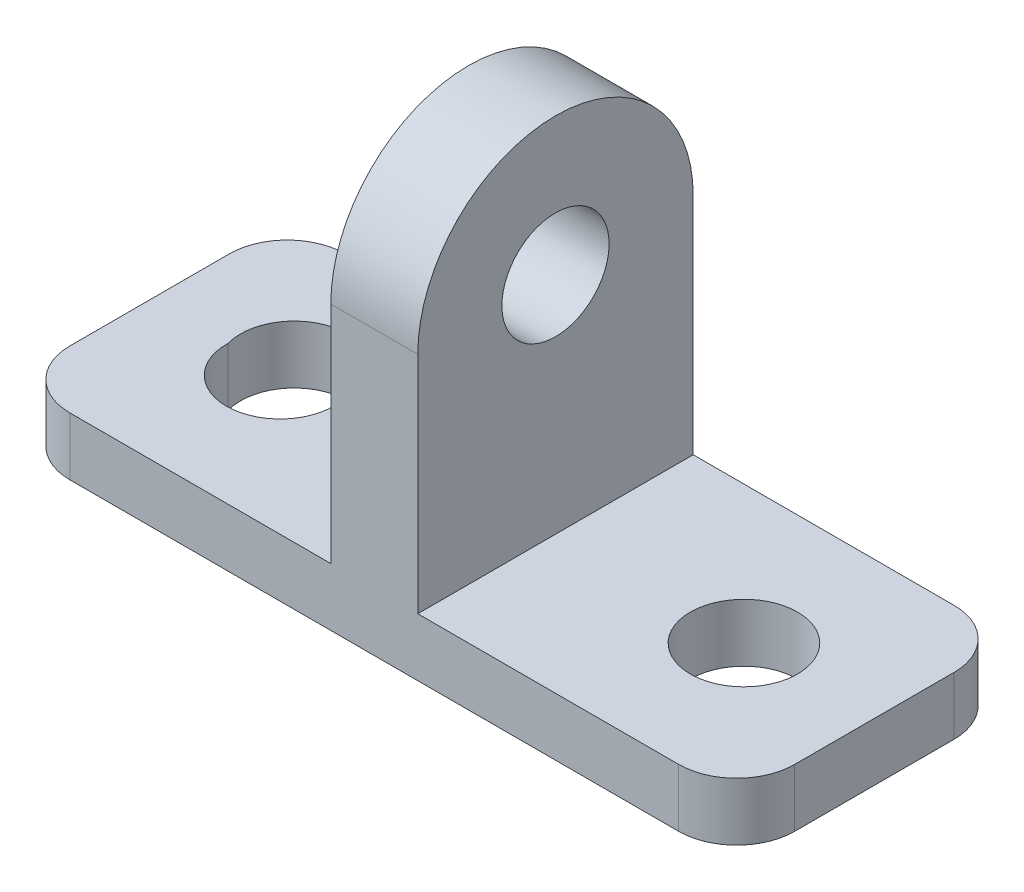
ISO-10303-21;
HEADER;
FILE_DESCRIPTION(('STEP AP214'),'2;1');
FILE_NAME('part.step','',(''),(''),'','','');
FILE_SCHEMA(('AUTOMOTIVE_DESIGN { 1 0 10303 214 1 1 1 1 }'));
ENDSEC;
DATA;
#1=APPLICATION_CONTEXT('core data for automotive mechanical design processes');
#2=APPLICATION_PROTOCOL_DEFINITION('international standard','automotive_design',2000,#1);
#3=PRODUCT_CONTEXT('',#1,'mechanical');
#4=PRODUCT('Part','Part','',(#3));
#5=PRODUCT_RELATED_PRODUCT_CATEGORY('part','',(#4));
#6=PRODUCT_DEFINITION_FORMATION('','',#4);
#7=PRODUCT_DEFINITION_CONTEXT('part definition',#1,'design');
#8=PRODUCT_DEFINITION('design','',#6,#7);
#9=PRODUCT_DEFINITION_SHAPE('','',#8);
#10=(LENGTH_UNIT() NAMED_UNIT(*) SI_UNIT(.MILLI.,.METRE.));
#11=(NAMED_UNIT(*) PLANE_ANGLE_UNIT() SI_UNIT($,.RADIAN.));
#12=(NAMED_UNIT(*) SI_UNIT($,.STERADIAN.) SOLID_ANGLE_UNIT());
#13=UNCERTAINTY_MEASURE_WITH_UNIT(LENGTH_MEASURE(1.E-05),#10,'distance_accuracy_value','');
#14=(GEOMETRIC_REPRESENTATION_CONTEXT(3) GLOBAL_UNCERTAINTY_ASSIGNED_CONTEXT((#13)) GLOBAL_UNIT_ASSIGNED_CONTEXT((#10,
#11,#12)) REPRESENTATION_CONTEXT('',''));
#15=CARTESIAN_POINT('',(0.,0.,0.));
#16=DIRECTION('',(0.,0.,1.));
#17=DIRECTION('',(1.,0.,0.));
#18=AXIS2_PLACEMENT_3D('',#15,#16,#17);
#19=CARTESIAN_POINT('',(0.,0.,9.5));
#20=DIRECTION('',(0.,0.,1.));
#21=DIRECTION('',(1.,0.,0.));
#22=AXIS2_PLACEMENT_3D('',#19,#20,#21);
#23=PLANE('',#22);
#24=DIRECTION('',(1.,0.,0.));
#25=VECTOR('',#24,1.);
#26=CARTESIAN_POINT('',(-1.5,-5.25,9.5));
#27=LINE('',#26,#25);
#28=CARTESIAN_POINT('',(-10.5,-5.25,9.5));
#29=VERTEX_POINT('',#28);
#30=CARTESIAN_POINT('',(-1.5,-5.25,9.5));
#31=VERTEX_POINT('',#30);
#32=EDGE_CURVE('E164',#29,#31,#27,.T.);
#33=ORIENTED_EDGE('',*,*,#32,.F.);
#34=DIRECTION('',(0.,-1.,0.));
#35=VECTOR('',#34,1.);
#36=CARTESIAN_POINT('',(-10.5,-7.25,9.5));
#37=LINE('',#36,#35);
#38=CARTESIAN_POINT('',(-10.5,-7.25,9.5));
#39=VERTEX_POINT('',#38);
#40=EDGE_CURVE('E238',#29,#39,#37,.T.);
#41=ORIENTED_EDGE('',*,*,#40,.T.);
#42=DIRECTION('',(1.,0.,0.));
#43=VECTOR('',#42,1.);
#44=CARTESIAN_POINT('',(-12.5,-7.25,9.5));
#45=LINE('',#44,#43);
#46=CARTESIAN_POINT('',(10.5,-7.25,9.5));
#47=VERTEX_POINT('',#46);
#48=EDGE_CURVE('E196',#39,#47,#45,.T.);
#49=ORIENTED_EDGE('',*,*,#48,.T.);
#50=DIRECTION('',(0.,1.,0.));
#51=VECTOR('',#50,1.);
#52=CARTESIAN_POINT('',(10.5,-5.25,9.5));
#53=LINE('',#52,#51);
#54=CARTESIAN_POINT('',(10.5,-5.25,9.5));
#55=VERTEX_POINT('',#54);
#56=EDGE_CURVE('E235',#47,#55,#53,.T.);
#57=ORIENTED_EDGE('',*,*,#56,.T.);
#58=DIRECTION('',(1.,0.,0.));
#59=VECTOR('',#58,1.);
#60=CARTESIAN_POINT('',(1.5,-5.25,9.5));
#61=LINE('',#60,#59);
#62=CARTESIAN_POINT('',(1.5,-5.25,9.5));
#63=VERTEX_POINT('',#62);
#64=EDGE_CURVE('E181',#63,#55,#61,.T.);
#65=ORIENTED_EDGE('',*,*,#64,.F.);
#66=DIRECTION('',(0.,-1.,0.));
#67=VECTOR('',#66,1.);
#68=CARTESIAN_POINT('',(1.5,7.25,9.5));
#69=LINE('',#68,#67);
#70=CARTESIAN_POINT('',(1.5,2.5,9.5));
#71=VERTEX_POINT('',#70);
#72=EDGE_CURVE('E174',#71,#63,#69,.T.);
#73=ORIENTED_EDGE('',*,*,#72,.F.);
#74=DIRECTION('',(1.,0.,0.));
#75=VECTOR('',#74,1.);
#76=CARTESIAN_POINT('',(-12.5,2.5,9.5));
#77=LINE('',#76,#75);
#78=CARTESIAN_POINT('',(-1.5,2.5,9.5));
#79=VERTEX_POINT('',#78);
#80=EDGE_CURVE('E192',#79,#71,#77,.T.);
#81=ORIENTED_EDGE('',*,*,#80,.F.);
#82=DIRECTION('',(0.,1.,0.));
#83=VECTOR('',#82,1.);
#84=CARTESIAN_POINT('',(-1.5,7.25,9.5));
#85=LINE('',#84,#83);
#86=EDGE_CURVE('E167',#31,#79,#85,.T.);
#87=ORIENTED_EDGE('',*,*,#86,.F.);
#88=EDGE_LOOP('',(#33,#41,#49,#57,#65,#73,#81,#87));
#89=FACE_BOUND('',#88,.T.);
#90=ADVANCED_FACE('F33',(#89),#23,.T.);
#91=CARTESIAN_POINT('',(0.,0.,0.));
#92=DIRECTION('',(0.,0.,1.));
#93=DIRECTION('',(1.,0.,0.));
#94=AXIS2_PLACEMENT_3D('',#91,#92,#93);
#95=PLANE('',#94);
#96=DIRECTION('',(1.,0.,0.));
#97=VECTOR('',#96,1.);
#98=CARTESIAN_POINT('',(-12.5,-7.25,0.));
#99=LINE('',#98,#97);
#100=CARTESIAN_POINT('',(-10.5,-7.25,0.));
#101=VERTEX_POINT('',#100);
#102=CARTESIAN_POINT('',(10.5,-7.25,0.));
#103=VERTEX_POINT('',#102);
#104=EDGE_CURVE('E194',#101,#103,#99,.T.);
#105=ORIENTED_EDGE('',*,*,#104,.F.);
#106=DIRECTION('',(0.,-1.,0.));
#107=VECTOR('',#106,1.);
#108=CARTESIAN_POINT('',(-10.5,0.,0.));
#109=LINE('',#108,#107);
#110=CARTESIAN_POINT('',(-10.5,-5.25,0.));
#111=VERTEX_POINT('',#110);
#112=EDGE_CURVE('E229',#101,#111,#109,.F.);
#113=ORIENTED_EDGE('',*,*,#112,.T.);
#114=DIRECTION('',(1.,0.,0.));
#115=VECTOR('',#114,1.);
#116=CARTESIAN_POINT('',(-1.5,-5.25,0.));
#117=LINE('',#116,#115);
#118=CARTESIAN_POINT('',(-1.5,-5.25,0.));
#119=VERTEX_POINT('',#118);
#120=EDGE_CURVE('E163',#111,#119,#117,.T.);
#121=ORIENTED_EDGE('',*,*,#120,.T.);
#122=DIRECTION('',(0.,1.,0.));
#123=VECTOR('',#122,1.);
#124=CARTESIAN_POINT('',(-1.5,7.25,0.));
#125=LINE('',#124,#123);
#126=CARTESIAN_POINT('',(-1.5,2.5,0.));
#127=VERTEX_POINT('',#126);
#128=EDGE_CURVE('E160',#119,#127,#125,.T.);
#129=ORIENTED_EDGE('',*,*,#128,.T.);
#130=DIRECTION('',(1.,0.,0.));
#131=VECTOR('',#130,1.);
#132=CARTESIAN_POINT('',(-12.5,2.5,0.));
#133=LINE('',#132,#131);
#134=CARTESIAN_POINT('',(1.5,2.5,0.));
#135=VERTEX_POINT('',#134);
#136=EDGE_CURVE('E189',#127,#135,#133,.T.);
#137=ORIENTED_EDGE('',*,*,#136,.T.);
#138=DIRECTION('',(0.,-1.,0.));
#139=VECTOR('',#138,1.);
#140=CARTESIAN_POINT('',(1.5,7.25,0.));
#141=LINE('',#140,#139);
#142=CARTESIAN_POINT('',(1.5,-5.25,0.));
#143=VERTEX_POINT('',#142);
#144=EDGE_CURVE('E177',#135,#143,#141,.T.);
#145=ORIENTED_EDGE('',*,*,#144,.T.);
#146=DIRECTION('',(1.,0.,0.));
#147=VECTOR('',#146,1.);
#148=CARTESIAN_POINT('',(1.5,-5.25,0.));
#149=LINE('',#148,#147);
#150=CARTESIAN_POINT('',(10.5,-5.25,0.));
#151=VERTEX_POINT('',#150);
#152=EDGE_CURVE('E180',#143,#151,#149,.T.);
#153=ORIENTED_EDGE('',*,*,#152,.T.);
#154=DIRECTION('',(0.,1.,0.));
#155=VECTOR('',#154,1.);
#156=CARTESIAN_POINT('',(10.5,0.,0.));
#157=LINE('',#156,#155);
#158=EDGE_CURVE('E227',#151,#103,#157,.F.);
#159=ORIENTED_EDGE('',*,*,#158,.T.);
#160=EDGE_LOOP('',(#105,#113,#121,#129,#137,#145,#153,#159));
#161=FACE_BOUND('',#160,.T.);
#162=ADVANCED_FACE('F254',(#161),#95,.F.);
#163=CARTESIAN_POINT('',(12.5,7.25,9.5));
#164=DIRECTION('',(-1.,0.,0.));
#165=DIRECTION('',(0.,-1.,0.));
#166=AXIS2_PLACEMENT_3D('',#163,#164,#165);
#167=PLANE('',#166);
#168=DIRECTION('',(0.,0.,-1.));
#169=VECTOR('',#168,1.);
#170=CARTESIAN_POINT('',(12.5,-7.25,9.5));
#171=LINE('',#170,#169);
#172=CARTESIAN_POINT('',(12.5,-7.25,7.5));
#173=VERTEX_POINT('',#172);
#174=CARTESIAN_POINT('',(12.5,-7.25,2.));
#175=VERTEX_POINT('',#174);
#176=EDGE_CURVE('E199',#173,#175,#171,.T.);
#177=ORIENTED_EDGE('',*,*,#176,.T.);
#178=DIRECTION('',(0.,1.,0.));
#179=VECTOR('',#178,1.);
#180=CARTESIAN_POINT('',(12.5,7.25,2.));
#181=LINE('',#180,#179);
#182=CARTESIAN_POINT('',(12.5,-5.25,2.));
#183=VERTEX_POINT('',#182);
#184=EDGE_CURVE('E243',#175,#183,#181,.T.);
#185=ORIENTED_EDGE('',*,*,#184,.T.);
#186=DIRECTION('',(0.,0.,1.));
#187=VECTOR('',#186,1.);
#188=CARTESIAN_POINT('',(12.5,-5.25,0.));
#189=LINE('',#188,#187);
#190=CARTESIAN_POINT('',(12.5,-5.25,7.5));
#191=VERTEX_POINT('',#190);
#192=EDGE_CURVE('E187',#183,#191,#189,.T.);
#193=ORIENTED_EDGE('',*,*,#192,.T.);
#194=DIRECTION('',(0.,1.,0.));
#195=VECTOR('',#194,1.);
#196=CARTESIAN_POINT('',(12.5,-7.25,7.5));
#197=LINE('',#196,#195);
#198=EDGE_CURVE('E241',#191,#173,#197,.F.);
#199=ORIENTED_EDGE('',*,*,#198,.T.);
#200=EDGE_LOOP('',(#177,#185,#193,#199));
#201=FACE_BOUND('',#200,.T.);
#202=ADVANCED_FACE('F263',(#201),#167,.F.);
#203=CARTESIAN_POINT('',(-12.5,7.25,9.5));
#204=DIRECTION('',(1.,0.,0.));
#205=DIRECTION('',(0.,1.,0.));
#206=AXIS2_PLACEMENT_3D('',#203,#204,#205);
#207=PLANE('',#206);
#208=DIRECTION('',(0.,0.,1.));
#209=VECTOR('',#208,1.);
#210=CARTESIAN_POINT('',(-12.5,-5.25,0.));
#211=LINE('',#210,#209);
#212=CARTESIAN_POINT('',(-12.5,-5.25,2.));
#213=VERTEX_POINT('',#212);
#214=CARTESIAN_POINT('',(-12.5,-5.25,7.5));
#215=VERTEX_POINT('',#214);
#216=EDGE_CURVE('E166',#213,#215,#211,.T.);
#217=ORIENTED_EDGE('',*,*,#216,.F.);
#218=DIRECTION('',(0.,-1.,0.));
#219=VECTOR('',#218,1.);
#220=CARTESIAN_POINT('',(-12.5,7.25,2.));
#221=LINE('',#220,#219);
#222=CARTESIAN_POINT('',(-12.5,-7.25,2.));
#223=VERTEX_POINT('',#222);
#224=EDGE_CURVE('E216',#213,#223,#221,.T.);
#225=ORIENTED_EDGE('',*,*,#224,.T.);
#226=DIRECTION('',(0.,0.,-1.));
#227=VECTOR('',#226,1.);
#228=CARTESIAN_POINT('',(-12.5,-7.25,9.5));
#229=LINE('',#228,#227);
#230=CARTESIAN_POINT('',(-12.5,-7.25,7.5));
#231=VERTEX_POINT('',#230);
#232=EDGE_CURVE('E204',#231,#223,#229,.T.);
#233=ORIENTED_EDGE('',*,*,#232,.F.);
#234=DIRECTION('',(0.,-1.,0.));
#235=VECTOR('',#234,1.);
#236=CARTESIAN_POINT('',(-12.5,-5.25,7.5));
#237=LINE('',#236,#235);
#238=EDGE_CURVE('E212',#231,#215,#237,.F.);
#239=ORIENTED_EDGE('',*,*,#238,.T.);
#240=EDGE_LOOP('',(#217,#225,#233,#239));
#241=FACE_BOUND('',#240,.T.);
#242=ADVANCED_FACE('F280',(#241),#207,.F.);
#243=CARTESIAN_POINT('',(-12.5,-7.25,9.5));
#244=DIRECTION('',(0.,1.,0.));
#245=DIRECTION('',(0.,0.,1.));
#246=AXIS2_PLACEMENT_3D('',#243,#244,#245);
#247=PLANE('',#246);
#248=CARTESIAN_POINT('',(8.,-7.25,4.75));
#249=DIRECTION('',(0.,1.,0.));
#250=DIRECTION('',(-1.,0.,0.));
#251=AXIS2_PLACEMENT_3D('',#248,#249,#250);
#252=CIRCLE('',#251,1.85);
#253=CARTESIAN_POINT('',(6.15,-7.25,4.75));
#254=VERTEX_POINT('',#253);
#255=EDGE_CURVE('E148',#254,#254,#252,.T.);
#256=ORIENTED_EDGE('',*,*,#255,.T.);
#257=EDGE_LOOP('',(#256));
#258=FACE_BOUND('',#257,.T.);
#259=CARTESIAN_POINT('',(-8.,-7.25,4.75));
#260=DIRECTION('',(0.,1.,0.));
#261=DIRECTION('',(-1.,0.,0.));
#262=AXIS2_PLACEMENT_3D('',#259,#260,#261);
#263=CIRCLE('',#262,1.85);
#264=CARTESIAN_POINT('',(-9.84902529193701,-7.25,4.68995443582362));
#265=VERTEX_POINT('',#264);
#266=CARTESIAN_POINT('',(-6.21736963616891,-7.25,4.25529909445458));
#267=VERTEX_POINT('',#266);
#268=EDGE_CURVE('E147',#265,#267,#263,.T.);
#269=ORIENTED_EDGE('',*,*,#268,.T.);
#270=CARTESIAN_POINT('',(-8.06639492810592,-7.25,4.19525353027821));
#271=DIRECTION('',(0.,1.,0.));
#272=DIRECTION('',(0.,0.,1.));
#273=AXIS2_PLACEMENT_3D('',#270,#271,#272);
#274=CIRCLE('',#273,1.85);
#275=EDGE_CURVE('E48',#267,#265,#274,.T.);
#276=ORIENTED_EDGE('',*,*,#275,.T.);
#277=EDGE_LOOP('',(#269,#276));
#278=FACE_BOUND('',#277,.T.);
#279=ORIENTED_EDGE('',*,*,#232,.T.);
#280=CARTESIAN_POINT('',(-10.5,-7.25,2.));
#281=DIRECTION('',(0.,1.,0.));
#282=DIRECTION('',(0.,0.,1.));
#283=AXIS2_PLACEMENT_3D('',#280,#281,#282);
#284=CIRCLE('',#283,2.);
#285=EDGE_CURVE('E225',#223,#101,#284,.F.);
#286=ORIENTED_EDGE('',*,*,#285,.T.);
#287=ORIENTED_EDGE('',*,*,#104,.T.);
#288=CARTESIAN_POINT('',(10.5,-7.25,2.));
#289=DIRECTION('',(0.,1.,0.));
#290=DIRECTION('',(0.,0.,1.));
#291=AXIS2_PLACEMENT_3D('',#288,#289,#290);
#292=CIRCLE('',#291,2.);
#293=EDGE_CURVE('E221',#103,#175,#292,.F.);
#294=ORIENTED_EDGE('',*,*,#293,.T.);
#295=ORIENTED_EDGE('',*,*,#176,.F.);
#296=CARTESIAN_POINT('',(10.5,-7.25,7.5));
#297=DIRECTION('',(0.,1.,0.));
#298=DIRECTION('',(0.,0.,1.));
#299=AXIS2_PLACEMENT_3D('',#296,#297,#298);
#300=CIRCLE('',#299,2.);
#301=EDGE_CURVE('E219',#173,#47,#300,.F.);
#302=ORIENTED_EDGE('',*,*,#301,.T.);
#303=ORIENTED_EDGE('',*,*,#48,.F.);
#304=CARTESIAN_POINT('',(-10.5,-7.25,7.5));
#305=DIRECTION('',(0.,1.,0.));
#306=DIRECTION('',(0.,0.,1.));
#307=AXIS2_PLACEMENT_3D('',#304,#305,#306);
#308=CIRCLE('',#307,2.);
#309=EDGE_CURVE('E223',#39,#231,#308,.F.);
#310=ORIENTED_EDGE('',*,*,#309,.T.);
#311=EDGE_LOOP('',(#279,#286,#287,#294,#295,#302,#303,#310));
#312=FACE_BOUND('',#311,.T.);
#313=ADVANCED_FACE('F260',(#258,#278,#312),#247,.F.);
#314=CARTESIAN_POINT('',(-12.5,2.5,4.75));
#315=DIRECTION('',(1.,0.,0.));
#316=DIRECTION('',(0.,1.,0.));
#317=AXIS2_PLACEMENT_3D('',#314,#315,#316);
#318=CYLINDRICAL_SURFACE('',#317,4.75);
#319=CARTESIAN_POINT('',(-1.5,2.5,4.75));
#320=DIRECTION('',(1.,0.,0.));
#321=DIRECTION('',(0.,1.,0.));
#322=AXIS2_PLACEMENT_3D('',#319,#320,#321);
#323=CIRCLE('',#322,4.75);
#324=EDGE_CURVE('E210',#127,#79,#323,.T.);
#325=ORIENTED_EDGE('',*,*,#324,.T.);
#326=ORIENTED_EDGE('',*,*,#80,.T.);
#327=CARTESIAN_POINT('',(1.5,2.5,4.75));
#328=DIRECTION('',(-1.,0.,0.));
#329=DIRECTION('',(0.,-1.,0.));
#330=AXIS2_PLACEMENT_3D('',#327,#328,#329);
#331=CIRCLE('',#330,4.75);
#332=EDGE_CURVE('E207',#71,#135,#331,.T.);
#333=ORIENTED_EDGE('',*,*,#332,.T.);
#334=ORIENTED_EDGE('',*,*,#136,.F.);
#335=EDGE_LOOP('',(#325,#326,#333,#334));
#336=FACE_BOUND('',#335,.T.);
#337=ADVANCED_FACE('F293',(#336),#318,.T.);
#338=CARTESIAN_POINT('',(1.5,7.25,0.));
#339=DIRECTION('',(-1.,0.,0.));
#340=DIRECTION('',(0.,-1.,0.));
#341=AXIS2_PLACEMENT_3D('',#338,#339,#340);
#342=PLANE('',#341);
#343=CARTESIAN_POINT('',(1.5,2.5,4.75));
#344=DIRECTION('',(1.,0.,0.));
#345=DIRECTION('',(0.,1.,0.));
#346=AXIS2_PLACEMENT_3D('',#343,#344,#345);
#347=CIRCLE('',#346,1.85);
#348=CARTESIAN_POINT('',(1.5,4.35,4.75));
#349=VERTEX_POINT('',#348);
#350=EDGE_CURVE('E150',#349,#349,#347,.T.);
#351=ORIENTED_EDGE('',*,*,#350,.F.);
#352=EDGE_LOOP('',(#351));
#353=FACE_BOUND('',#352,.T.);
#354=ORIENTED_EDGE('',*,*,#72,.T.);
#355=DIRECTION('',(0.,0.,1.));
#356=VECTOR('',#355,1.);
#357=CARTESIAN_POINT('',(1.5,-5.25,0.));
#358=LINE('',#357,#356);
#359=EDGE_CURVE('E184',#143,#63,#358,.T.);
#360=ORIENTED_EDGE('',*,*,#359,.F.);
#361=ORIENTED_EDGE('',*,*,#144,.F.);
#362=ORIENTED_EDGE('',*,*,#332,.F.);
#363=EDGE_LOOP('',(#354,#360,#361,#362));
#364=FACE_BOUND('',#363,.T.);
#365=ADVANCED_FACE('F298',(#353,#364),#342,.F.);
#366=CARTESIAN_POINT('',(1.5,-5.25,0.));
#367=DIRECTION('',(0.,-1.,0.));
#368=DIRECTION('',(0.,0.,-1.));
#369=AXIS2_PLACEMENT_3D('',#366,#367,#368);
#370=PLANE('',#369);
#371=CARTESIAN_POINT('',(8.,-5.25,4.75));
#372=DIRECTION('',(0.,1.,0.));
#373=DIRECTION('',(-1.,0.,0.));
#374=AXIS2_PLACEMENT_3D('',#371,#372,#373);
#375=CIRCLE('',#374,1.85);
#376=CARTESIAN_POINT('',(6.15,-5.25,4.75));
#377=VERTEX_POINT('',#376);
#378=EDGE_CURVE('E153',#377,#377,#375,.T.);
#379=ORIENTED_EDGE('',*,*,#378,.F.);
#380=EDGE_LOOP('',(#379));
#381=FACE_BOUND('',#380,.T.);
#382=ORIENTED_EDGE('',*,*,#192,.F.);
#383=CARTESIAN_POINT('',(10.5,-5.25,2.));
#384=DIRECTION('',(0.,-1.,0.));
#385=DIRECTION('',(0.,0.,-1.));
#386=AXIS2_PLACEMENT_3D('',#383,#384,#385);
#387=CIRCLE('',#386,2.);
#388=EDGE_CURVE('E139',#183,#151,#387,.F.);
#389=ORIENTED_EDGE('',*,*,#388,.T.);
#390=ORIENTED_EDGE('',*,*,#152,.F.);
#391=ORIENTED_EDGE('',*,*,#359,.T.);
#392=ORIENTED_EDGE('',*,*,#64,.T.);
#393=CARTESIAN_POINT('',(10.5,-5.25,7.5));
#394=DIRECTION('',(0.,-1.,0.));
#395=DIRECTION('',(0.,0.,-1.));
#396=AXIS2_PLACEMENT_3D('',#393,#394,#395);
#397=CIRCLE('',#396,2.);
#398=EDGE_CURVE('E56',#55,#191,#397,.F.);
#399=ORIENTED_EDGE('',*,*,#398,.T.);
#400=EDGE_LOOP('',(#382,#389,#390,#391,#392,#399));
#401=FACE_BOUND('',#400,.T.);
#402=ADVANCED_FACE('F248',(#381,#401),#370,.F.);
#403=CARTESIAN_POINT('',(-1.5,7.25,0.));
#404=DIRECTION('',(1.,0.,0.));
#405=DIRECTION('',(0.,1.,0.));
#406=AXIS2_PLACEMENT_3D('',#403,#404,#405);
#407=PLANE('',#406);
#408=CARTESIAN_POINT('',(-1.5,2.5,4.75));
#409=DIRECTION('',(1.,0.,0.));
#410=DIRECTION('',(0.,1.,0.));
#411=AXIS2_PLACEMENT_3D('',#408,#409,#410);
#412=CIRCLE('',#411,1.85);
#413=CARTESIAN_POINT('',(-1.5,4.35,4.75));
#414=VERTEX_POINT('',#413);
#415=EDGE_CURVE('E159',#414,#414,#412,.T.);
#416=ORIENTED_EDGE('',*,*,#415,.T.);
#417=EDGE_LOOP('',(#416));
#418=FACE_BOUND('',#417,.T.);
#419=ORIENTED_EDGE('',*,*,#324,.F.);
#420=ORIENTED_EDGE('',*,*,#128,.F.);
#421=DIRECTION('',(0.,0.,1.));
#422=VECTOR('',#421,1.);
#423=CARTESIAN_POINT('',(-1.5,-5.25,0.));
#424=LINE('',#423,#422);
#425=EDGE_CURVE('E171',#119,#31,#424,.T.);
#426=ORIENTED_EDGE('',*,*,#425,.T.);
#427=ORIENTED_EDGE('',*,*,#86,.T.);
#428=EDGE_LOOP('',(#419,#420,#426,#427));
#429=FACE_BOUND('',#428,.T.);
#430=ADVANCED_FACE('F290',(#418,#429),#407,.F.);
#431=CARTESIAN_POINT('',(-1.5,-5.25,0.));
#432=DIRECTION('',(0.,-1.,0.));
#433=DIRECTION('',(0.,0.,-1.));
#434=AXIS2_PLACEMENT_3D('',#431,#432,#433);
#435=PLANE('',#434);
#436=CARTESIAN_POINT('',(-8.,-5.25,4.75));
#437=DIRECTION('',(0.,1.,0.));
#438=DIRECTION('',(-1.,0.,0.));
#439=AXIS2_PLACEMENT_3D('',#436,#437,#438);
#440=CIRCLE('',#439,1.85);
#441=CARTESIAN_POINT('',(-9.84902529193701,-5.24999999999651,4.68995443582362));
#442=VERTEX_POINT('',#441);
#443=CARTESIAN_POINT('',(-6.21736963616891,-5.24999999999651,4.25529909445458));
#444=VERTEX_POINT('',#443);
#445=EDGE_CURVE('E144',#442,#444,#440,.T.);
#446=ORIENTED_EDGE('',*,*,#445,.F.);
#447=CARTESIAN_POINT('',(-8.06639492810592,-5.24999999999651,4.19525353027821));
#448=DIRECTION('',(0.,1.,0.));
#449=DIRECTION('',(0.,0.,1.));
#450=AXIS2_PLACEMENT_3D('',#447,#448,#449);
#451=CIRCLE('',#450,1.85);
#452=EDGE_CURVE('E134',#444,#442,#451,.T.);
#453=ORIENTED_EDGE('',*,*,#452,.F.);
#454=EDGE_LOOP('',(#446,#453));
#455=FACE_BOUND('',#454,.T.);
#456=ORIENTED_EDGE('',*,*,#120,.F.);
#457=CARTESIAN_POINT('',(-10.5,-5.25,2.));
#458=DIRECTION('',(0.,-1.,0.));
#459=DIRECTION('',(0.,0.,-1.));
#460=AXIS2_PLACEMENT_3D('',#457,#458,#459);
#461=CIRCLE('',#460,2.);
#462=EDGE_CURVE('E233',#111,#213,#461,.F.);
#463=ORIENTED_EDGE('',*,*,#462,.T.);
#464=ORIENTED_EDGE('',*,*,#216,.T.);
#465=CARTESIAN_POINT('',(-10.5,-5.25,7.5));
#466=DIRECTION('',(0.,-1.,0.));
#467=DIRECTION('',(0.,0.,-1.));
#468=AXIS2_PLACEMENT_3D('',#465,#466,#467);
#469=CIRCLE('',#468,2.);
#470=EDGE_CURVE('E231',#215,#29,#469,.F.);
#471=ORIENTED_EDGE('',*,*,#470,.T.);
#472=ORIENTED_EDGE('',*,*,#32,.T.);
#473=ORIENTED_EDGE('',*,*,#425,.F.);
#474=EDGE_LOOP('',(#456,#463,#464,#471,#472,#473));
#475=FACE_BOUND('',#474,.T.);
#476=ADVANCED_FACE('F142',(#455,#475),#435,.F.);
#477=CARTESIAN_POINT('',(-12.5,2.5,4.75));
#478=DIRECTION('',(1.,0.,0.));
#479=DIRECTION('',(0.,1.,0.));
#480=AXIS2_PLACEMENT_3D('',#477,#478,#479);
#481=CYLINDRICAL_SURFACE('',#480,1.85);
#482=ORIENTED_EDGE('',*,*,#350,.T.);
#483=EDGE_LOOP('',(#482));
#484=FACE_BOUND('',#483,.T.);
#485=ORIENTED_EDGE('',*,*,#415,.F.);
#486=EDGE_LOOP('',(#485));
#487=FACE_BOUND('',#486,.T.);
#488=ADVANCED_FACE('F326',(#484,#487),#481,.F.);
#489=CARTESIAN_POINT('',(-10.5,7.25,2.));
#490=DIRECTION('',(0.,-1.,0.));
#491=DIRECTION('',(1.,0.,0.));
#492=AXIS2_PLACEMENT_3D('',#489,#490,#491);
#493=CYLINDRICAL_SURFACE('',#492,2.);
#494=ORIENTED_EDGE('',*,*,#462,.F.);
#495=ORIENTED_EDGE('',*,*,#112,.F.);
#496=ORIENTED_EDGE('',*,*,#285,.F.);
#497=ORIENTED_EDGE('',*,*,#224,.F.);
#498=EDGE_LOOP('',(#494,#495,#496,#497));
#499=FACE_BOUND('',#498,.T.);
#500=ADVANCED_FACE('F284',(#499),#493,.T.);
#501=CARTESIAN_POINT('',(-10.5,0.,7.5));
#502=DIRECTION('',(0.,1.,0.));
#503=DIRECTION('',(-1.,0.,0.));
#504=AXIS2_PLACEMENT_3D('',#501,#502,#503);
#505=CYLINDRICAL_SURFACE('',#504,2.);
#506=ORIENTED_EDGE('',*,*,#470,.F.);
#507=ORIENTED_EDGE('',*,*,#238,.F.);
#508=ORIENTED_EDGE('',*,*,#309,.F.);
#509=ORIENTED_EDGE('',*,*,#40,.F.);
#510=EDGE_LOOP('',(#506,#507,#508,#509));
#511=FACE_BOUND('',#510,.T.);
#512=ADVANCED_FACE('F275',(#511),#505,.T.);
#513=CARTESIAN_POINT('',(10.5,7.25,2.));
#514=DIRECTION('',(0.,1.,0.));
#515=DIRECTION('',(-1.,0.,0.));
#516=AXIS2_PLACEMENT_3D('',#513,#514,#515);
#517=CYLINDRICAL_SURFACE('',#516,2.);
#518=ORIENTED_EDGE('',*,*,#293,.F.);
#519=ORIENTED_EDGE('',*,*,#158,.F.);
#520=ORIENTED_EDGE('',*,*,#388,.F.);
#521=ORIENTED_EDGE('',*,*,#184,.F.);
#522=EDGE_LOOP('',(#518,#519,#520,#521));
#523=FACE_BOUND('',#522,.T.);
#524=ADVANCED_FACE('F257',(#523),#517,.T.);
#525=CARTESIAN_POINT('',(10.5,0.,7.5));
#526=DIRECTION('',(0.,-1.,0.));
#527=DIRECTION('',(1.,0.,0.));
#528=AXIS2_PLACEMENT_3D('',#525,#526,#527);
#529=CYLINDRICAL_SURFACE('',#528,2.);
#530=ORIENTED_EDGE('',*,*,#301,.F.);
#531=ORIENTED_EDGE('',*,*,#198,.F.);
#532=ORIENTED_EDGE('',*,*,#398,.F.);
#533=ORIENTED_EDGE('',*,*,#56,.F.);
#534=EDGE_LOOP('',(#530,#531,#532,#533));
#535=FACE_BOUND('',#534,.T.);
#536=ADVANCED_FACE('F35',(#535),#529,.T.);
#537=CARTESIAN_POINT('',(-8.,-7.25,4.75));
#538=DIRECTION('',(0.,1.,0.));
#539=DIRECTION('',(-1.,0.,0.));
#540=AXIS2_PLACEMENT_3D('',#537,#538,#539);
#541=CYLINDRICAL_SURFACE('',#540,1.85);
#542=ORIENTED_EDGE('',*,*,#268,.F.);
#543=DIRECTION('',(0.,1.,0.));
#544=VECTOR('',#543,1.);
#545=CARTESIAN_POINT('',(-9.84902529193701,-6.24999999999825,4.68995443582362));
#546=LINE('',#545,#544);
#547=EDGE_CURVE('E11',#265,#442,#546,.T.);
#548=ORIENTED_EDGE('',*,*,#547,.T.);
#549=ORIENTED_EDGE('',*,*,#445,.T.);
#550=DIRECTION('',(0.,1.,0.));
#551=VECTOR('',#550,1.);
#552=CARTESIAN_POINT('',(-6.21736963616891,-6.24999999999825,4.25529909445458));
#553=LINE('',#552,#551);
#554=EDGE_CURVE('E41',#444,#267,#553,.F.);
#555=ORIENTED_EDGE('',*,*,#554,.T.);
#556=EDGE_LOOP('',(#542,#548,#549,#555));
#557=FACE_BOUND('',#556,.T.);
#558=ADVANCED_FACE('F146',(#557),#541,.F.);
#559=CARTESIAN_POINT('',(8.,-7.25,4.75));
#560=DIRECTION('',(0.,1.,0.));
#561=DIRECTION('',(-1.,0.,0.));
#562=AXIS2_PLACEMENT_3D('',#559,#560,#561);
#563=CYLINDRICAL_SURFACE('',#562,1.85);
#564=ORIENTED_EDGE('',*,*,#255,.F.);
#565=EDGE_LOOP('',(#564));
#566=FACE_BOUND('',#565,.T.);
#567=ORIENTED_EDGE('',*,*,#378,.T.);
#568=EDGE_LOOP('',(#567));
#569=FACE_BOUND('',#568,.T.);
#570=ADVANCED_FACE('F336',(#566,#569),#563,.F.);
#571=CARTESIAN_POINT('',(-8.06639492810592,-7.25,4.19525353027821));
#572=DIRECTION('',(0.,1.,0.));
#573=DIRECTION('',(0.,0.,1.));
#574=AXIS2_PLACEMENT_3D('',#571,#572,#573);
#575=CYLINDRICAL_SURFACE('',#574,1.85);
#576=ORIENTED_EDGE('',*,*,#275,.F.);
#577=ORIENTED_EDGE('',*,*,#554,.F.);
#578=ORIENTED_EDGE('',*,*,#452,.T.);
#579=ORIENTED_EDGE('',*,*,#547,.F.);
#580=EDGE_LOOP('',(#576,#577,#578,#579));
#581=FACE_BOUND('',#580,.T.);
#582=ADVANCED_FACE('F133',(#581),#575,.F.);
#583=CLOSED_SHELL('',(#90,#162,#202,#242,#313,#337,#365,#402,#430,#476,#488,#500,#512,#524,#536,
#558,#570,#582));
#584=MANIFOLD_SOLID_BREP('B2',#583);
#585=ADVANCED_BREP_SHAPE_REPRESENTATION('',(#18,#584),#14);
#586=SHAPE_DEFINITION_REPRESENTATION(#9,#585);
ENDSEC;
END-ISO-10303-21;
